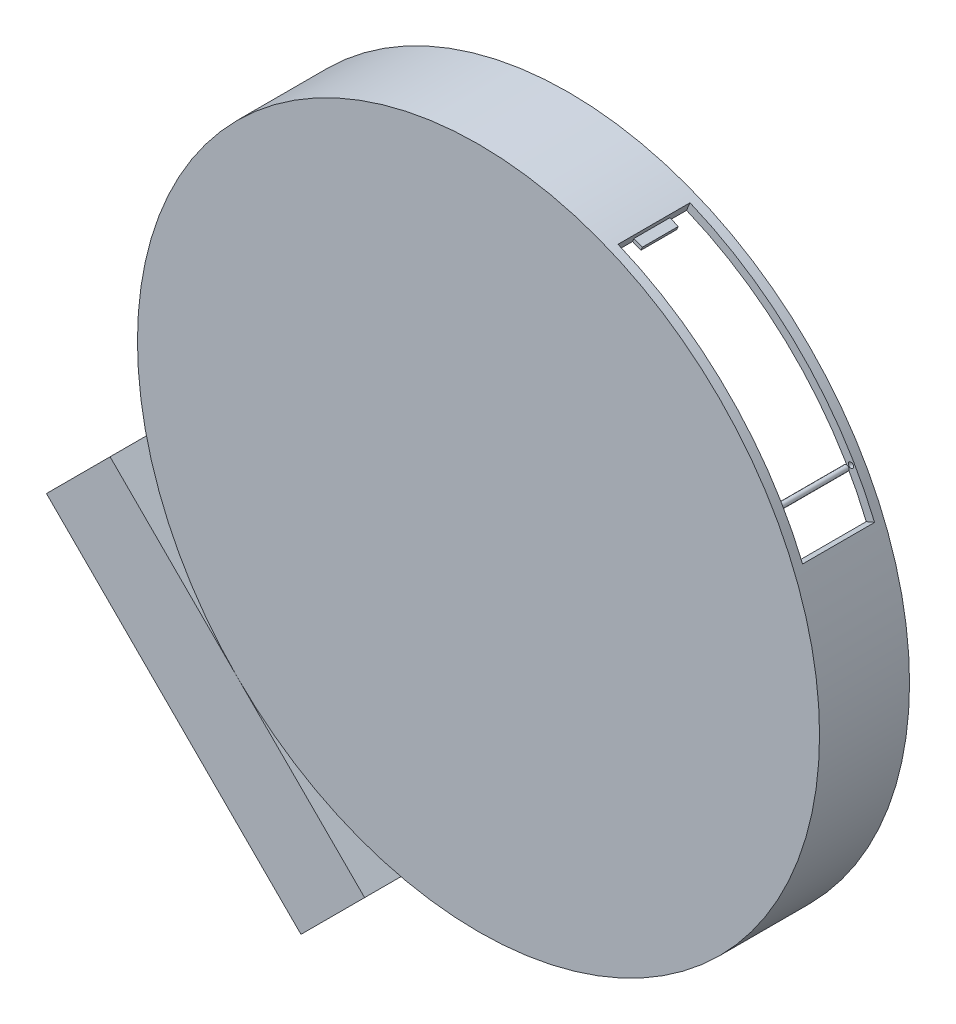
ISO-10303-21;
HEADER;
FILE_DESCRIPTION(('STEP AP214'),'2;1');
FILE_NAME('part.step','',(''),(''),'','','');
FILE_SCHEMA(('AUTOMOTIVE_DESIGN { 1 0 10303 214 1 1 1 1 }'));
ENDSEC;
DATA;
#1=APPLICATION_CONTEXT('core data for automotive mechanical design processes');
#2=APPLICATION_PROTOCOL_DEFINITION('international standard','automotive_design',2000,#1);
#3=PRODUCT_CONTEXT('',#1,'mechanical');
#4=PRODUCT('Part','Part','',(#3));
#5=PRODUCT_RELATED_PRODUCT_CATEGORY('part','',(#4));
#6=PRODUCT_DEFINITION_FORMATION('','',#4);
#7=PRODUCT_DEFINITION_CONTEXT('part definition',#1,'design');
#8=PRODUCT_DEFINITION('design','',#6,#7);
#9=PRODUCT_DEFINITION_SHAPE('','',#8);
#10=(LENGTH_UNIT() NAMED_UNIT(*) SI_UNIT(.MILLI.,.METRE.));
#11=(NAMED_UNIT(*) PLANE_ANGLE_UNIT() SI_UNIT($,.RADIAN.));
#12=(NAMED_UNIT(*) SI_UNIT($,.STERADIAN.) SOLID_ANGLE_UNIT());
#13=UNCERTAINTY_MEASURE_WITH_UNIT(LENGTH_MEASURE(1.E-05),#10,'distance_accuracy_value','');
#14=(GEOMETRIC_REPRESENTATION_CONTEXT(3) GLOBAL_UNCERTAINTY_ASSIGNED_CONTEXT((#13)) GLOBAL_UNIT_ASSIGNED_CONTEXT((#10,
#11,#12)) REPRESENTATION_CONTEXT('',''));
#15=CARTESIAN_POINT('',(0.,0.,0.));
#16=DIRECTION('',(0.,0.,1.));
#17=DIRECTION('',(1.,0.,0.));
#18=AXIS2_PLACEMENT_3D('',#15,#16,#17);
#19=CARTESIAN_POINT('',(0.,0.,10.));
#20=DIRECTION('',(0.923879532511282,-0.382683432365102,0.));
#21=DIRECTION('',(0.382683432365102,0.923879532511282,0.));
#22=AXIS2_PLACEMENT_3D('',#19,#20,#21);
#23=PLANE('',#22);
#24=DIRECTION('',(0.,0.,-1.));
#25=VECTOR('',#24,1.);
#26=CARTESIAN_POINT('',(142.740920272183,344.607065626708,0.));
#27=LINE('',#26,#25);
#28=CARTESIAN_POINT('',(142.740920272183,344.607065626708,70.));
#29=VERTEX_POINT('',#28);
#30=CARTESIAN_POINT('',(142.740920272183,344.607065626708,30.));
#31=VERTEX_POINT('',#30);
#32=EDGE_CURVE('E91',#29,#31,#27,.T.);
#33=ORIENTED_EDGE('',*,*,#32,.T.);
#34=DIRECTION('',(0.382683432365102,0.923879532511282,0.));
#35=VECTOR('',#34,1.);
#36=CARTESIAN_POINT('',(0.,0.,30.));
#37=LINE('',#36,#35);
#38=CARTESIAN_POINT('',(141.210186542723,340.911547496663,30.));
#39=VERTEX_POINT('',#38);
#40=EDGE_CURVE('E267',#39,#31,#37,.T.);
#41=ORIENTED_EDGE('',*,*,#40,.F.);
#42=DIRECTION('',(0.,0.,-1.));
#43=VECTOR('',#42,1.);
#44=CARTESIAN_POINT('',(141.210186542723,340.911547496663,100.));
#45=LINE('',#44,#43);
#46=CARTESIAN_POINT('',(141.210186542723,340.911547496663,10.));
#47=VERTEX_POINT('',#46);
#48=EDGE_CURVE('E223',#47,#39,#45,.F.);
#49=ORIENTED_EDGE('',*,*,#48,.F.);
#50=DIRECTION('',(0.382683432365102,0.923879532511282,0.));
#51=VECTOR('',#50,1.);
#52=CARTESIAN_POINT('',(0.,0.,10.));
#53=LINE('',#52,#51);
#54=CARTESIAN_POINT('',(145.037020866374,350.150342821776,10.));
#55=VERTEX_POINT('',#54);
#56=EDGE_CURVE('E191',#47,#55,#53,.T.);
#57=ORIENTED_EDGE('',*,*,#56,.T.);
#58=DIRECTION('',(0.,0.,1.));
#59=VECTOR('',#58,1.);
#60=CARTESIAN_POINT('',(145.037020866374,350.150342821776,10.));
#61=LINE('',#60,#59);
#62=CARTESIAN_POINT('',(145.037020866374,350.150342821776,90.));
#63=VERTEX_POINT('',#62);
#64=EDGE_CURVE('E215',#55,#63,#61,.T.);
#65=ORIENTED_EDGE('',*,*,#64,.T.);
#66=DIRECTION('',(0.382683432365102,0.923879532511282,0.));
#67=VECTOR('',#66,1.);
#68=CARTESIAN_POINT('',(0.,0.,90.));
#69=LINE('',#68,#67);
#70=CARTESIAN_POINT('',(141.210186542723,340.911547496663,90.));
#71=VERTEX_POINT('',#70);
#72=EDGE_CURVE('E190',#71,#63,#69,.T.);
#73=ORIENTED_EDGE('',*,*,#72,.F.);
#74=CARTESIAN_POINT('',(141.210186542723,340.911547496663,70.));
#75=VERTEX_POINT('',#74);
#76=EDGE_CURVE('E222',#75,#71,#45,.F.);
#77=ORIENTED_EDGE('',*,*,#76,.F.);
#78=DIRECTION('',(0.382683432365102,0.923879532511282,0.));
#79=VECTOR('',#78,1.);
#80=CARTESIAN_POINT('',(0.,0.,70.));
#81=LINE('',#80,#79);
#82=EDGE_CURVE('E96',#75,#29,#81,.T.);
#83=ORIENTED_EDGE('',*,*,#82,.T.);
#84=EDGE_LOOP('',(#33,#41,#49,#57,#65,#73,#77,#83));
#85=FACE_BOUND('',#84,.T.);
#86=ADVANCED_FACE('F75',(#85),#23,.T.);
#87=CARTESIAN_POINT('',(323.893501015378,187.000000000004,95.));
#88=DIRECTION('',(0.,0.,-1.));
#89=DIRECTION('',(-1.,0.,0.));
#90=AXIS2_PLACEMENT_3D('',#87,#88,#89);
#91=CYLINDRICAL_SURFACE('',#90,2.99999999999999);
#92=CARTESIAN_POINT('',(323.893501015378,187.000000000004,90.));
#93=DIRECTION('',(0.,0.,1.));
#94=DIRECTION('',(1.,0.,0.));
#95=AXIS2_PLACEMENT_3D('',#92,#93,#94);
#96=CIRCLE('',#95,2.99999999999999);
#97=CARTESIAN_POINT('',(326.893501015378,187.000000000004,90.));
#98=VERTEX_POINT('',#97);
#99=EDGE_CURVE('E186',#98,#98,#96,.T.);
#100=ORIENTED_EDGE('',*,*,#99,.F.);
#101=EDGE_LOOP('',(#100));
#102=FACE_BOUND('',#101,.T.);
#103=CARTESIAN_POINT('',(323.89350101538,187.,15.));
#104=DIRECTION('',(0.,0.,-1.));
#105=DIRECTION('',(-1.,0.,0.));
#106=AXIS2_PLACEMENT_3D('',#103,#104,#105);
#107=CIRCLE('',#106,2.99999999999999);
#108=CARTESIAN_POINT('',(320.89350101538,187.,15.));
#109=VERTEX_POINT('',#108);
#110=EDGE_CURVE('E173',#109,#109,#107,.T.);
#111=ORIENTED_EDGE('',*,*,#110,.F.);
#112=EDGE_LOOP('',(#111));
#113=FACE_BOUND('',#112,.T.);
#114=ADVANCED_FACE('F247',(#102,#113),#91,.T.);
#115=CARTESIAN_POINT('',(0.,0.,100.));
#116=DIRECTION('',(0.,0.,-1.));
#117=DIRECTION('',(-1.,0.,0.));
#118=AXIS2_PLACEMENT_3D('',#115,#116,#117);
#119=CYLINDRICAL_SURFACE('',#118,379.);
#120=CARTESIAN_POINT('',(0.,0.,100.));
#121=DIRECTION('',(0.,0.,1.));
#122=DIRECTION('',(1.,0.,0.));
#123=AXIS2_PLACEMENT_3D('',#120,#121,#122);
#124=CIRCLE('',#123,379.);
#125=CARTESIAN_POINT('',(379.,0.,100.));
#126=VERTEX_POINT('',#125);
#127=EDGE_CURVE('E235',#126,#126,#124,.T.);
#128=ORIENTED_EDGE('',*,*,#127,.F.);
#129=EDGE_LOOP('',(#128));
#130=FACE_BOUND('',#129,.T.);
#131=CARTESIAN_POINT('',(0.,0.,0.));
#132=DIRECTION('',(0.,0.,1.));
#133=DIRECTION('',(1.,0.,0.));
#134=AXIS2_PLACEMENT_3D('',#131,#132,#133);
#135=CIRCLE('',#134,379.);
#136=CARTESIAN_POINT('',(379.,0.,0.));
#137=VERTEX_POINT('',#136);
#138=EDGE_CURVE('E84',#137,#137,#135,.T.);
#139=ORIENTED_EDGE('',*,*,#138,.T.);
#140=EDGE_LOOP('',(#139));
#141=FACE_BOUND('',#140,.T.);
#142=CARTESIAN_POINT('',(0.,0.,10.));
#143=DIRECTION('',(0.,0.,-1.));
#144=DIRECTION('',(1.,0.,0.));
#145=AXIS2_PLACEMENT_3D('',#142,#143,#144);
#146=CIRCLE('',#145,379.);
#147=CARTESIAN_POINT('',(350.150342821776,145.037020866374,10.));
#148=VERTEX_POINT('',#147);
#149=EDGE_CURVE('E194',#55,#148,#146,.T.);
#150=ORIENTED_EDGE('',*,*,#149,.T.);
#151=DIRECTION('',(0.,0.,1.));
#152=VECTOR('',#151,1.);
#153=CARTESIAN_POINT('',(350.150342821776,145.037020866374,10.));
#154=LINE('',#153,#152);
#155=CARTESIAN_POINT('',(350.150342821776,145.037020866374,90.));
#156=VERTEX_POINT('',#155);
#157=EDGE_CURVE('E203',#148,#156,#154,.T.);
#158=ORIENTED_EDGE('',*,*,#157,.T.);
#159=CARTESIAN_POINT('',(0.,0.,90.));
#160=DIRECTION('',(0.,0.,-1.));
#161=DIRECTION('',(-1.,0.,0.));
#162=AXIS2_PLACEMENT_3D('',#159,#160,#161);
#163=CIRCLE('',#162,379.);
#164=EDGE_CURVE('E207',#63,#156,#163,.T.);
#165=ORIENTED_EDGE('',*,*,#164,.F.);
#166=ORIENTED_EDGE('',*,*,#64,.F.);
#167=EDGE_LOOP('',(#150,#158,#165,#166));
#168=FACE_BOUND('',#167,.T.);
#169=ADVANCED_FACE('F243',(#130,#141,#168),#119,.T.);
#170=CARTESIAN_POINT('',(0.,0.,100.));
#171=DIRECTION('',(0.,0.,-1.));
#172=DIRECTION('',(-1.,0.,0.));
#173=AXIS2_PLACEMENT_3D('',#170,#171,#172);
#174=CYLINDRICAL_SURFACE('',#173,369.);
#175=CARTESIAN_POINT('',(0.,0.,0.));
#176=DIRECTION('',(0.,0.,1.));
#177=DIRECTION('',(1.,0.,0.));
#178=AXIS2_PLACEMENT_3D('',#175,#176,#177);
#179=CIRCLE('',#178,369.);
#180=CARTESIAN_POINT('',(369.,0.,0.));
#181=VERTEX_POINT('',#180);
#182=EDGE_CURVE('E231',#181,#181,#179,.T.);
#183=ORIENTED_EDGE('',*,*,#182,.F.);
#184=EDGE_LOOP('',(#183));
#185=FACE_BOUND('',#184,.T.);
#186=CARTESIAN_POINT('',(0.,0.,10.));
#187=DIRECTION('',(0.,0.,1.));
#188=DIRECTION('',(1.,0.,0.));
#189=AXIS2_PLACEMENT_3D('',#186,#187,#188);
#190=CIRCLE('',#189,369.);
#191=CARTESIAN_POINT('',(340.911547496663,141.210186542723,10.));
#192=VERTEX_POINT('',#191);
#193=EDGE_CURVE('E13',#192,#47,#190,.T.);
#194=ORIENTED_EDGE('',*,*,#193,.T.);
#195=ORIENTED_EDGE('',*,*,#48,.T.);
#196=DIRECTION('',(0.,0.,-1.));
#197=VECTOR('',#196,1.);
#198=CARTESIAN_POINT('',(141.210186542723,340.911547496663,0.));
#199=LINE('',#198,#197);
#200=EDGE_CURVE('E166',#75,#39,#199,.T.);
#201=ORIENTED_EDGE('',*,*,#200,.F.);
#202=ORIENTED_EDGE('',*,*,#76,.T.);
#203=CARTESIAN_POINT('',(0.,0.,90.));
#204=DIRECTION('',(0.,0.,1.));
#205=DIRECTION('',(1.,0.,0.));
#206=AXIS2_PLACEMENT_3D('',#203,#204,#205);
#207=CIRCLE('',#206,369.);
#208=CARTESIAN_POINT('',(340.911547496663,141.210186542723,90.));
#209=VERTEX_POINT('',#208);
#210=EDGE_CURVE('E227',#71,#209,#207,.T.);
#211=ORIENTED_EDGE('',*,*,#210,.T.);
#212=DIRECTION('',(0.,0.,-1.));
#213=VECTOR('',#212,1.);
#214=CARTESIAN_POINT('',(340.911547496663,141.210186542723,100.));
#215=LINE('',#214,#213);
#216=EDGE_CURVE('E218',#209,#192,#215,.T.);
#217=ORIENTED_EDGE('',*,*,#216,.T.);
#218=EDGE_LOOP('',(#194,#195,#201,#202,#211,#217));
#219=FACE_BOUND('',#218,.T.);
#220=ADVANCED_FACE('F246',(#185,#219),#174,.F.);
#221=CARTESIAN_POINT('',(0.,0.,100.));
#222=DIRECTION('',(0.,0.,1.));
#223=DIRECTION('',(1.,0.,0.));
#224=AXIS2_PLACEMENT_3D('',#221,#222,#223);
#225=PLANE('',#224);
#226=ORIENTED_EDGE('',*,*,#127,.T.);
#227=EDGE_LOOP('',(#226));
#228=FACE_BOUND('',#227,.T.);
#229=ADVANCED_FACE('F77',(#228),#225,.T.);
#230=CARTESIAN_POINT('',(0.,0.,0.));
#231=DIRECTION('',(0.,0.,1.));
#232=DIRECTION('',(1.,0.,0.));
#233=AXIS2_PLACEMENT_3D('',#230,#231,#232);
#234=PLANE('',#233);
#235=CARTESIAN_POINT('',(323.89350101538,187.,0.));
#236=DIRECTION('',(0.,0.,-1.));
#237=DIRECTION('',(-1.,0.,0.));
#238=AXIS2_PLACEMENT_3D('',#235,#236,#237);
#239=CIRCLE('',#238,2.99999999999999);
#240=CARTESIAN_POINT('',(320.89350101538,187.,0.));
#241=VERTEX_POINT('',#240);
#242=EDGE_CURVE('E168',#241,#241,#239,.T.);
#243=ORIENTED_EDGE('',*,*,#242,.F.);
#244=EDGE_LOOP('',(#243));
#245=FACE_BOUND('',#244,.T.);
#246=ORIENTED_EDGE('',*,*,#182,.T.);
#247=EDGE_LOOP('',(#246));
#248=FACE_BOUND('',#247,.T.);
#249=ORIENTED_EDGE('',*,*,#138,.F.);
#250=EDGE_LOOP('',(#249));
#251=FACE_BOUND('',#250,.T.);
#252=ADVANCED_FACE('F310',(#245,#248,#251),#234,.F.);
#253=CARTESIAN_POINT('',(0.,0.,90.));
#254=DIRECTION('',(0.,0.,1.));
#255=DIRECTION('',(1.,0.,0.));
#256=AXIS2_PLACEMENT_3D('',#253,#254,#255);
#257=PLANE('',#256);
#258=ORIENTED_EDGE('',*,*,#99,.T.);
#259=EDGE_LOOP('',(#258));
#260=FACE_BOUND('',#259,.T.);
#261=ORIENTED_EDGE('',*,*,#210,.F.);
#262=ORIENTED_EDGE('',*,*,#72,.T.);
#263=ORIENTED_EDGE('',*,*,#164,.T.);
#264=DIRECTION('',(-0.923879532511282,-0.382683432365102,0.));
#265=VECTOR('',#264,1.);
#266=CARTESIAN_POINT('',(350.150342821776,145.037020866374,90.));
#267=LINE('',#266,#265);
#268=EDGE_CURVE('E195',#156,#209,#267,.T.);
#269=ORIENTED_EDGE('',*,*,#268,.T.);
#270=EDGE_LOOP('',(#261,#262,#263,#269));
#271=FACE_BOUND('',#270,.T.);
#272=ADVANCED_FACE('F266',(#260,#271),#257,.F.);
#273=CARTESIAN_POINT('',(350.150342821776,145.037020866374,10.));
#274=DIRECTION('',(-0.382683432365102,0.923879532511282,0.));
#275=DIRECTION('',(-0.923879532511282,-0.382683432365102,0.));
#276=AXIS2_PLACEMENT_3D('',#273,#274,#275);
#277=PLANE('',#276);
#278=ORIENTED_EDGE('',*,*,#268,.F.);
#279=ORIENTED_EDGE('',*,*,#157,.F.);
#280=DIRECTION('',(-0.923879532511282,-0.382683432365102,0.));
#281=VECTOR('',#280,1.);
#282=CARTESIAN_POINT('',(350.150342821776,145.037020866374,10.));
#283=LINE('',#282,#281);
#284=EDGE_CURVE('E199',#148,#192,#283,.T.);
#285=ORIENTED_EDGE('',*,*,#284,.T.);
#286=ORIENTED_EDGE('',*,*,#216,.F.);
#287=EDGE_LOOP('',(#278,#279,#285,#286));
#288=FACE_BOUND('',#287,.T.);
#289=ADVANCED_FACE('F261',(#288),#277,.T.);
#290=CARTESIAN_POINT('',(0.,0.,10.));
#291=DIRECTION('',(0.,0.,1.));
#292=DIRECTION('',(1.,0.,0.));
#293=AXIS2_PLACEMENT_3D('',#290,#291,#292);
#294=PLANE('',#293);
#295=CARTESIAN_POINT('',(323.89350101538,187.,10.));
#296=DIRECTION('',(0.,0.,1.));
#297=DIRECTION('',(1.,0.,0.));
#298=AXIS2_PLACEMENT_3D('',#295,#296,#297);
#299=CIRCLE('',#298,2.99999999999999);
#300=CARTESIAN_POINT('',(326.89350101538,187.,10.));
#301=VERTEX_POINT('',#300);
#302=EDGE_CURVE('E181',#301,#301,#299,.T.);
#303=ORIENTED_EDGE('',*,*,#302,.F.);
#304=EDGE_LOOP('',(#303));
#305=FACE_BOUND('',#304,.T.);
#306=ORIENTED_EDGE('',*,*,#284,.F.);
#307=ORIENTED_EDGE('',*,*,#149,.F.);
#308=ORIENTED_EDGE('',*,*,#56,.F.);
#309=ORIENTED_EDGE('',*,*,#193,.F.);
#310=EDGE_LOOP('',(#306,#307,#308,#309));
#311=FACE_BOUND('',#310,.T.);
#312=ADVANCED_FACE('F257',(#305,#311),#294,.T.);
#313=CARTESIAN_POINT('',(0.,0.,15.));
#314=DIRECTION('',(0.,0.,-1.));
#315=DIRECTION('',(-1.,0.,0.));
#316=AXIS2_PLACEMENT_3D('',#313,#314,#315);
#317=PLANE('',#316);
#318=ORIENTED_EDGE('',*,*,#110,.T.);
#319=EDGE_LOOP('',(#318));
#320=FACE_BOUND('',#319,.T.);
#321=ADVANCED_FACE('F324',(#320),#317,.T.);
#322=CARTESIAN_POINT('',(323.89350101538,187.,15.));
#323=DIRECTION('',(0.,0.,-1.));
#324=DIRECTION('',(-1.,0.,0.));
#325=AXIS2_PLACEMENT_3D('',#322,#323,#324);
#326=CYLINDRICAL_SURFACE('',#325,2.99999999999999);
#327=ORIENTED_EDGE('',*,*,#302,.T.);
#328=EDGE_LOOP('',(#327));
#329=FACE_BOUND('',#328,.T.);
#330=ORIENTED_EDGE('',*,*,#242,.T.);
#331=EDGE_LOOP('',(#330));
#332=FACE_BOUND('',#331,.T.);
#333=ADVANCED_FACE('F322',(#329,#332),#326,.F.);
#334=CARTESIAN_POINT('',(150.448981867836,337.084713173012,0.));
#335=DIRECTION('',(0.382683432365102,0.923879532511282,0.));
#336=DIRECTION('',(-0.923879532511282,0.382683432365102,0.));
#337=AXIS2_PLACEMENT_3D('',#334,#335,#336);
#338=PLANE('',#337);
#339=ORIENTED_EDGE('',*,*,#200,.T.);
#340=DIRECTION('',(-0.923879532511282,0.382683432365102,0.));
#341=VECTOR('',#340,1.);
#342=CARTESIAN_POINT('',(150.448981867836,337.084713173012,30.));
#343=LINE('',#342,#341);
#344=CARTESIAN_POINT('',(150.448981867836,337.084713173012,30.));
#345=VERTEX_POINT('',#344);
#346=EDGE_CURVE('E146',#345,#39,#343,.T.);
#347=ORIENTED_EDGE('',*,*,#346,.F.);
#348=DIRECTION('',(0.,0.,-1.));
#349=VECTOR('',#348,1.);
#350=CARTESIAN_POINT('',(150.448981867836,337.084713173012,0.));
#351=LINE('',#350,#349);
#352=CARTESIAN_POINT('',(150.448981867836,337.084713173012,70.));
#353=VERTEX_POINT('',#352);
#354=EDGE_CURVE('E154',#353,#345,#351,.T.);
#355=ORIENTED_EDGE('',*,*,#354,.F.);
#356=DIRECTION('',(-0.923879532511282,0.382683432365102,0.));
#357=VECTOR('',#356,1.);
#358=CARTESIAN_POINT('',(150.448981867836,337.084713173012,70.));
#359=LINE('',#358,#357);
#360=EDGE_CURVE('E279',#353,#75,#359,.T.);
#361=ORIENTED_EDGE('',*,*,#360,.T.);
#362=EDGE_LOOP('',(#339,#347,#355,#361));
#363=FACE_BOUND('',#362,.T.);
#364=ADVANCED_FACE('F165',(#363),#338,.F.);
#365=CARTESIAN_POINT('',(9.23879532511286,-3.82683432365104,30.));
#366=DIRECTION('',(0.,0.,1.));
#367=DIRECTION('',(1.,0.,0.));
#368=AXIS2_PLACEMENT_3D('',#365,#366,#367);
#369=PLANE('',#368);
#370=ORIENTED_EDGE('',*,*,#40,.T.);
#371=DIRECTION('',(-0.923879532511282,0.382683432365102,0.));
#372=VECTOR('',#371,1.);
#373=CARTESIAN_POINT('',(151.979715597296,340.780231303057,30.));
#374=LINE('',#373,#372);
#375=CARTESIAN_POINT('',(151.979715597296,340.780231303057,30.));
#376=VERTEX_POINT('',#375);
#377=EDGE_CURVE('E148',#376,#31,#374,.T.);
#378=ORIENTED_EDGE('',*,*,#377,.F.);
#379=DIRECTION('',(0.382683432365102,0.923879532511282,0.));
#380=VECTOR('',#379,1.);
#381=CARTESIAN_POINT('',(9.23879532511286,-3.82683432365104,30.));
#382=LINE('',#381,#380);
#383=EDGE_CURVE('E141',#345,#376,#382,.T.);
#384=ORIENTED_EDGE('',*,*,#383,.F.);
#385=ORIENTED_EDGE('',*,*,#346,.T.);
#386=EDGE_LOOP('',(#370,#378,#384,#385));
#387=FACE_BOUND('',#386,.T.);
#388=ADVANCED_FACE('F144',(#387),#369,.F.);
#389=CARTESIAN_POINT('',(151.979715597296,340.780231303057,0.));
#390=DIRECTION('',(0.382683432365102,0.923879532511282,0.));
#391=DIRECTION('',(-0.923879532511282,0.382683432365102,0.));
#392=AXIS2_PLACEMENT_3D('',#389,#390,#391);
#393=PLANE('',#392);
#394=ORIENTED_EDGE('',*,*,#32,.F.);
#395=DIRECTION('',(-0.923879532511282,0.382683432365102,0.));
#396=VECTOR('',#395,1.);
#397=CARTESIAN_POINT('',(151.979715597296,340.780231303057,70.));
#398=LINE('',#397,#396);
#399=CARTESIAN_POINT('',(151.979715597296,340.780231303057,70.));
#400=VERTEX_POINT('',#399);
#401=EDGE_CURVE('E175',#400,#29,#398,.T.);
#402=ORIENTED_EDGE('',*,*,#401,.F.);
#403=DIRECTION('',(0.,0.,-1.));
#404=VECTOR('',#403,1.);
#405=CARTESIAN_POINT('',(151.979715597296,340.780231303057,0.));
#406=LINE('',#405,#404);
#407=EDGE_CURVE('E153',#400,#376,#406,.T.);
#408=ORIENTED_EDGE('',*,*,#407,.T.);
#409=ORIENTED_EDGE('',*,*,#377,.T.);
#410=EDGE_LOOP('',(#394,#402,#408,#409));
#411=FACE_BOUND('',#410,.T.);
#412=ADVANCED_FACE('F285',(#411),#393,.T.);
#413=CARTESIAN_POINT('',(9.23879532511285,-3.82683432365104,70.));
#414=DIRECTION('',(0.,0.,1.));
#415=DIRECTION('',(1.,0.,0.));
#416=AXIS2_PLACEMENT_3D('',#413,#414,#415);
#417=PLANE('',#416);
#418=ORIENTED_EDGE('',*,*,#82,.F.);
#419=ORIENTED_EDGE('',*,*,#360,.F.);
#420=DIRECTION('',(0.382683432365102,0.923879532511282,0.));
#421=VECTOR('',#420,1.);
#422=CARTESIAN_POINT('',(9.23879532511285,-3.82683432365104,70.));
#423=LINE('',#422,#421);
#424=EDGE_CURVE('E160',#353,#400,#423,.T.);
#425=ORIENTED_EDGE('',*,*,#424,.T.);
#426=ORIENTED_EDGE('',*,*,#401,.T.);
#427=EDGE_LOOP('',(#418,#419,#425,#426));
#428=FACE_BOUND('',#427,.T.);
#429=ADVANCED_FACE('F283',(#428),#417,.T.);
#430=CARTESIAN_POINT('',(9.23879532511286,-3.82683432365104,0.));
#431=DIRECTION('',(0.923879532511282,-0.382683432365102,0.));
#432=DIRECTION('',(0.382683432365102,0.923879532511282,0.));
#433=AXIS2_PLACEMENT_3D('',#430,#431,#432);
#434=PLANE('',#433);
#435=ORIENTED_EDGE('',*,*,#354,.T.);
#436=ORIENTED_EDGE('',*,*,#383,.T.);
#437=ORIENTED_EDGE('',*,*,#407,.F.);
#438=ORIENTED_EDGE('',*,*,#424,.F.);
#439=EDGE_LOOP('',(#435,#436,#437,#438));
#440=FACE_BOUND('',#439,.T.);
#441=ADVANCED_FACE('F158',(#440),#434,.T.);
#442=CLOSED_SHELL('',(#86,#114,#169,#220,#229,#252,#272,#289,#312,#321,#333,#364,#388,#412,#429,#441));
#443=MANIFOLD_SOLID_BREP('B2',#442);
#444=CARTESIAN_POINT('',(-267.993470069699,-267.993470069704,100.));
#445=DIRECTION('',(-0.707106781186544,-0.707106781186551,0.));
#446=DIRECTION('',(0.707106781186551,-0.707106781186544,0.));
#447=AXIS2_PLACEMENT_3D('',#444,#445,#446);
#448=PLANE('',#447);
#449=DIRECTION('',(0.707106781186553,-0.707106781186541,0.));
#450=VECTOR('',#449,1.);
#451=CARTESIAN_POINT('',(-267.993470069699,-267.993470069704,100.));
#452=LINE('',#451,#450);
#453=CARTESIAN_POINT('',(-409.414826307012,-126.572113832393,100.));
#454=VERTEX_POINT('',#453);
#455=CARTESIAN_POINT('',(-126.572113832388,-409.414826307012,100.));
#456=VERTEX_POINT('',#455);
#457=EDGE_CURVE('E539',#454,#456,#452,.T.);
#458=ORIENTED_EDGE('',*,*,#457,.T.);
#459=DIRECTION('',(0.,0.,-1.));
#460=VECTOR('',#459,1.);
#461=CARTESIAN_POINT('',(-126.572113832388,-409.414826307012,100.));
#462=LINE('',#461,#460);
#463=CARTESIAN_POINT('',(-126.572113832388,-409.414826307012,0.));
#464=VERTEX_POINT('',#463);
#465=EDGE_CURVE('E524',#456,#464,#462,.T.);
#466=ORIENTED_EDGE('',*,*,#465,.T.);
#467=DIRECTION('',(-0.707106781186551,0.707106781186544,0.));
#468=VECTOR('',#467,1.);
#469=CARTESIAN_POINT('',(-267.993470069699,-267.993470069704,0.));
#470=LINE('',#469,#468);
#471=CARTESIAN_POINT('',(-409.414826307012,-126.572113832393,0.));
#472=VERTEX_POINT('',#471);
#473=EDGE_CURVE('E561',#464,#472,#470,.T.);
#474=ORIENTED_EDGE('',*,*,#473,.T.);
#475=DIRECTION('',(0.,0.,-1.));
#476=VECTOR('',#475,1.);
#477=CARTESIAN_POINT('',(-409.414826307012,-126.572113832393,100.));
#478=LINE('',#477,#476);
#479=EDGE_CURVE('E73',#454,#472,#478,.T.);
#480=ORIENTED_EDGE('',*,*,#479,.F.);
#481=EDGE_LOOP('',(#458,#466,#474,#480));
#482=FACE_BOUND('',#481,.T.);
#483=ADVANCED_FACE('F520',(#482),#448,.F.);
#484=CARTESIAN_POINT('',(-409.414826307012,-126.572113832393,100.));
#485=DIRECTION('',(0.707106781186548,-0.707106781186547,0.));
#486=DIRECTION('',(0.707106781186547,0.707106781186548,0.));
#487=AXIS2_PLACEMENT_3D('',#484,#485,#486);
#488=PLANE('',#487);
#489=DIRECTION('',(-0.707106781186547,-0.707106781186548,0.));
#490=VECTOR('',#489,1.);
#491=CARTESIAN_POINT('',(-409.414826307012,-126.572113832393,0.));
#492=LINE('',#491,#490);
#493=CARTESIAN_POINT('',(-480.125504425666,-197.282791951047,0.));
#494=VERTEX_POINT('',#493);
#495=EDGE_CURVE('E587',#472,#494,#492,.T.);
#496=ORIENTED_EDGE('',*,*,#495,.T.);
#497=DIRECTION('',(0.,0.,-1.));
#498=VECTOR('',#497,1.);
#499=CARTESIAN_POINT('',(-480.125504425666,-197.282791951047,100.));
#500=LINE('',#499,#498);
#501=CARTESIAN_POINT('',(-480.125504425666,-197.282791951047,100.));
#502=VERTEX_POINT('',#501);
#503=EDGE_CURVE('E530',#502,#494,#500,.T.);
#504=ORIENTED_EDGE('',*,*,#503,.F.);
#505=DIRECTION('',(-0.707106781186547,-0.707106781186548,0.));
#506=VECTOR('',#505,1.);
#507=CARTESIAN_POINT('',(-409.414826307012,-126.572113832393,100.));
#508=LINE('',#507,#506);
#509=EDGE_CURVE('E578',#454,#502,#508,.T.);
#510=ORIENTED_EDGE('',*,*,#509,.F.);
#511=ORIENTED_EDGE('',*,*,#479,.T.);
#512=EDGE_LOOP('',(#496,#504,#510,#511));
#513=FACE_BOUND('',#512,.T.);
#514=ADVANCED_FACE('F592',(#513),#488,.F.);
#515=CARTESIAN_POINT('',(-197.282791951043,-480.125504425668,100.));
#516=DIRECTION('',(-0.707106781186545,-0.70710678118655,0.));
#517=DIRECTION('',(0.70710678118655,-0.707106781186545,0.));
#518=AXIS2_PLACEMENT_3D('',#515,#516,#517);
#519=PLANE('',#518);
#520=DIRECTION('',(-0.70710678118655,0.707106781186545,0.));
#521=VECTOR('',#520,1.);
#522=CARTESIAN_POINT('',(-197.282791951043,-480.125504425668,0.));
#523=LINE('',#522,#521);
#524=CARTESIAN_POINT('',(-197.282791951043,-480.125504425668,0.));
#525=VERTEX_POINT('',#524);
#526=EDGE_CURVE('E570',#525,#494,#523,.T.);
#527=ORIENTED_EDGE('',*,*,#526,.F.);
#528=DIRECTION('',(0.,0.,-1.));
#529=VECTOR('',#528,1.);
#530=CARTESIAN_POINT('',(-197.282791951043,-480.125504425668,100.));
#531=LINE('',#530,#529);
#532=CARTESIAN_POINT('',(-197.282791951043,-480.125504425668,100.));
#533=VERTEX_POINT('',#532);
#534=EDGE_CURVE('E565',#533,#525,#531,.T.);
#535=ORIENTED_EDGE('',*,*,#534,.F.);
#536=DIRECTION('',(-0.70710678118655,0.707106781186545,0.));
#537=VECTOR('',#536,1.);
#538=CARTESIAN_POINT('',(-197.282791951043,-480.125504425668,100.));
#539=LINE('',#538,#537);
#540=EDGE_CURVE('E568',#533,#502,#539,.T.);
#541=ORIENTED_EDGE('',*,*,#540,.T.);
#542=ORIENTED_EDGE('',*,*,#503,.T.);
#543=EDGE_LOOP('',(#527,#535,#541,#542));
#544=FACE_BOUND('',#543,.T.);
#545=ADVANCED_FACE('F567',(#544),#519,.T.);
#546=CARTESIAN_POINT('',(-126.572113832388,-409.414826307012,100.));
#547=DIRECTION('',(0.707106781186554,-0.707106781186541,0.));
#548=DIRECTION('',(0.707106781186541,0.707106781186554,0.));
#549=AXIS2_PLACEMENT_3D('',#546,#547,#548);
#550=PLANE('',#549);
#551=DIRECTION('',(-0.707106781186541,-0.707106781186554,0.));
#552=VECTOR('',#551,1.);
#553=CARTESIAN_POINT('',(-126.572113832388,-409.414826307012,0.));
#554=LINE('',#553,#552);
#555=EDGE_CURVE('E584',#464,#525,#554,.T.);
#556=ORIENTED_EDGE('',*,*,#555,.F.);
#557=ORIENTED_EDGE('',*,*,#465,.F.);
#558=DIRECTION('',(-0.707106781186541,-0.707106781186554,0.));
#559=VECTOR('',#558,1.);
#560=CARTESIAN_POINT('',(-126.572113832388,-409.414826307012,100.));
#561=LINE('',#560,#559);
#562=EDGE_CURVE('E576',#456,#533,#561,.T.);
#563=ORIENTED_EDGE('',*,*,#562,.T.);
#564=ORIENTED_EDGE('',*,*,#534,.T.);
#565=EDGE_LOOP('',(#556,#557,#563,#564));
#566=FACE_BOUND('',#565,.T.);
#567=ADVANCED_FACE('F522',(#566),#550,.T.);
#568=CARTESIAN_POINT('',(0.,0.,100.));
#569=DIRECTION('',(0.,0.,-1.));
#570=DIRECTION('',(-1.,0.,0.));
#571=AXIS2_PLACEMENT_3D('',#568,#569,#570);
#572=PLANE('',#571);
#573=ORIENTED_EDGE('',*,*,#457,.F.);
#574=ORIENTED_EDGE('',*,*,#509,.T.);
#575=ORIENTED_EDGE('',*,*,#540,.F.);
#576=ORIENTED_EDGE('',*,*,#562,.F.);
#577=EDGE_LOOP('',(#573,#574,#575,#576));
#578=FACE_BOUND('',#577,.T.);
#579=ADVANCED_FACE('F575',(#578),#572,.F.);
#580=CARTESIAN_POINT('',(0.,0.,0.));
#581=DIRECTION('',(0.,0.,-1.));
#582=DIRECTION('',(-1.,0.,0.));
#583=AXIS2_PLACEMENT_3D('',#580,#581,#582);
#584=PLANE('',#583);
#585=ORIENTED_EDGE('',*,*,#473,.F.);
#586=ORIENTED_EDGE('',*,*,#555,.T.);
#587=ORIENTED_EDGE('',*,*,#526,.T.);
#588=ORIENTED_EDGE('',*,*,#495,.F.);
#589=EDGE_LOOP('',(#585,#586,#587,#588));
#590=FACE_BOUND('',#589,.T.);
#591=ADVANCED_FACE('F594',(#590),#584,.T.);
#592=CLOSED_SHELL('',(#483,#514,#545,#567,#579,#591));
#593=MANIFOLD_SOLID_BREP('B7',#592);
#594=ADVANCED_BREP_SHAPE_REPRESENTATION('',(#18,#443,#593),#14);
#595=SHAPE_DEFINITION_REPRESENTATION(#9,#594);
ENDSEC;
END-ISO-10303-21;
